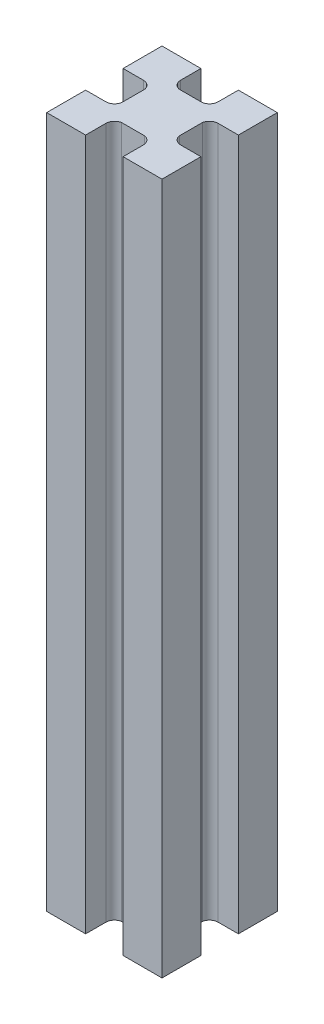
ISO-10303-21;
HEADER;
FILE_DESCRIPTION(('STEP AP214'),'2;1');
FILE_NAME('part.step','',(''),(''),'','','');
FILE_SCHEMA(('AUTOMOTIVE_DESIGN { 1 0 10303 214 1 1 1 1 }'));
ENDSEC;
DATA;
#1=APPLICATION_CONTEXT('core data for automotive mechanical design processes');
#2=APPLICATION_PROTOCOL_DEFINITION('international standard','automotive_design',2000,#1);
#3=PRODUCT_CONTEXT('',#1,'mechanical');
#4=PRODUCT('Part','Part','',(#3));
#5=PRODUCT_RELATED_PRODUCT_CATEGORY('part','',(#4));
#6=PRODUCT_DEFINITION_FORMATION('','',#4);
#7=PRODUCT_DEFINITION_CONTEXT('part definition',#1,'design');
#8=PRODUCT_DEFINITION('design','',#6,#7);
#9=PRODUCT_DEFINITION_SHAPE('','',#8);
#10=(LENGTH_UNIT() NAMED_UNIT(*) SI_UNIT(.MILLI.,.METRE.));
#11=(NAMED_UNIT(*) PLANE_ANGLE_UNIT() SI_UNIT($,.RADIAN.));
#12=(NAMED_UNIT(*) SI_UNIT($,.STERADIAN.) SOLID_ANGLE_UNIT());
#13=UNCERTAINTY_MEASURE_WITH_UNIT(LENGTH_MEASURE(1.E-05),#10,'distance_accuracy_value','');
#14=(GEOMETRIC_REPRESENTATION_CONTEXT(3) GLOBAL_UNCERTAINTY_ASSIGNED_CONTEXT((#13)) GLOBAL_UNIT_ASSIGNED_CONTEXT((#10,
#11,#12)) REPRESENTATION_CONTEXT('',''));
#15=CARTESIAN_POINT('',(0.,0.,0.));
#16=DIRECTION('',(0.,0.,1.));
#17=DIRECTION('',(1.,0.,0.));
#18=AXIS2_PLACEMENT_3D('',#15,#16,#17);
#19=CARTESIAN_POINT('',(670.000000000003,140.,2.16493489801906E-12));
#20=DIRECTION('',(-1.,0.,0.));
#21=DIRECTION('',(0.,0.,1.));
#22=AXIS2_PLACEMENT_3D('',#19,#20,#21);
#23=PLANE('',#22);
#24=DIRECTION('',(0.,0.,-1.));
#25=VECTOR('',#24,1.);
#26=CARTESIAN_POINT('',(670.000000000003,20.,2.16493489801906E-12));
#27=LINE('',#26,#25);
#28=CARTESIAN_POINT('',(670.000000000003,20.,10.0000000000022));
#29=VERTEX_POINT('',#28);
#30=CARTESIAN_POINT('',(669.99999999999,20.,3.24999999999571));
#31=VERTEX_POINT('',#30);
#32=EDGE_CURVE('E11',#29,#31,#27,.T.);
#33=ORIENTED_EDGE('',*,*,#32,.T.);
#34=DIRECTION('',(0.,1.,0.));
#35=VECTOR('',#34,1.);
#36=CARTESIAN_POINT('',(669.99999999999,20.,3.24999999999571));
#37=LINE('',#36,#35);
#38=CARTESIAN_POINT('',(669.99999999999,140.,3.24999999999571));
#39=VERTEX_POINT('',#38);
#40=EDGE_CURVE('E360',#31,#39,#37,.T.);
#41=ORIENTED_EDGE('',*,*,#40,.T.);
#42=DIRECTION('',(0.,0.,-1.));
#43=VECTOR('',#42,1.);
#44=CARTESIAN_POINT('',(670.000000000003,140.,2.16493489801906E-12));
#45=LINE('',#44,#43);
#46=CARTESIAN_POINT('',(670.000000000003,140.,10.0000000000022));
#47=VERTEX_POINT('',#46);
#48=EDGE_CURVE('E49',#47,#39,#45,.T.);
#49=ORIENTED_EDGE('',*,*,#48,.F.);
#50=DIRECTION('',(0.,-1.,0.));
#51=VECTOR('',#50,1.);
#52=CARTESIAN_POINT('',(670.000000000003,140.,10.0000000000022));
#53=LINE('',#52,#51);
#54=EDGE_CURVE('E406',#47,#29,#53,.T.);
#55=ORIENTED_EDGE('',*,*,#54,.T.);
#56=EDGE_LOOP('',(#33,#41,#49,#55));
#57=FACE_BOUND('',#56,.T.);
#58=ADVANCED_FACE('F45',(#57),#23,.F.);
#59=CARTESIAN_POINT('',(650.000000000003,140.,-9.99999999999784));
#60=DIRECTION('',(0.,0.,1.));
#61=DIRECTION('',(1.,0.,0.));
#62=AXIS2_PLACEMENT_3D('',#59,#60,#61);
#63=PLANE('',#62);
#64=DIRECTION('',(-1.,0.,0.));
#65=VECTOR('',#64,1.);
#66=CARTESIAN_POINT('',(650.000000000003,20.,-9.99999999999784));
#67=LINE('',#66,#65);
#68=CARTESIAN_POINT('',(670.000000000003,20.,-9.99999999999784));
#69=VERTEX_POINT('',#68);
#70=CARTESIAN_POINT('',(663.250000000008,20.,-10.000000000004));
#71=VERTEX_POINT('',#70);
#72=EDGE_CURVE('E419',#69,#71,#67,.T.);
#73=ORIENTED_EDGE('',*,*,#72,.T.);
#74=DIRECTION('',(0.,1.,0.));
#75=VECTOR('',#74,1.);
#76=CARTESIAN_POINT('',(663.250000000008,20.,-10.000000000004));
#77=LINE('',#76,#75);
#78=CARTESIAN_POINT('',(663.250000000008,140.,-10.000000000004));
#79=VERTEX_POINT('',#78);
#80=EDGE_CURVE('E278',#71,#79,#77,.T.);
#81=ORIENTED_EDGE('',*,*,#80,.T.);
#82=DIRECTION('',(-1.,0.,0.));
#83=VECTOR('',#82,1.);
#84=CARTESIAN_POINT('',(650.000000000003,140.,-9.99999999999784));
#85=LINE('',#84,#83);
#86=CARTESIAN_POINT('',(670.000000000003,140.,-9.99999999999784));
#87=VERTEX_POINT('',#86);
#88=EDGE_CURVE('E427',#87,#79,#85,.T.);
#89=ORIENTED_EDGE('',*,*,#88,.F.);
#90=DIRECTION('',(0.,-1.,0.));
#91=VECTOR('',#90,1.);
#92=CARTESIAN_POINT('',(670.000000000003,140.,-9.99999999999784));
#93=LINE('',#92,#91);
#94=EDGE_CURVE('E256',#87,#69,#93,.T.);
#95=ORIENTED_EDGE('',*,*,#94,.T.);
#96=EDGE_LOOP('',(#73,#81,#89,#95));
#97=FACE_BOUND('',#96,.T.);
#98=ADVANCED_FACE('F530',(#97),#63,.F.);
#99=CARTESIAN_POINT('',(650.000000000003,140.,10.0000000000022));
#100=DIRECTION('',(1.,0.,0.));
#101=DIRECTION('',(0.,0.,-1.));
#102=AXIS2_PLACEMENT_3D('',#99,#100,#101);
#103=PLANE('',#102);
#104=DIRECTION('',(0.,0.,1.));
#105=VECTOR('',#104,1.);
#106=CARTESIAN_POINT('',(650.000000000003,20.,10.0000000000022));
#107=LINE('',#106,#105);
#108=CARTESIAN_POINT('',(650.000000000003,20.,-9.99999999999784));
#109=VERTEX_POINT('',#108);
#110=CARTESIAN_POINT('',(650.,20.,-3.25000000001271));
#111=VERTEX_POINT('',#110);
#112=EDGE_CURVE('E415',#109,#111,#107,.T.);
#113=ORIENTED_EDGE('',*,*,#112,.T.);
#114=DIRECTION('',(0.,1.,0.));
#115=VECTOR('',#114,1.);
#116=CARTESIAN_POINT('',(650.,20.,-3.25000000001271));
#117=LINE('',#116,#115);
#118=CARTESIAN_POINT('',(650.,140.,-3.25000000001271));
#119=VERTEX_POINT('',#118);
#120=EDGE_CURVE('E270',#111,#119,#117,.T.);
#121=ORIENTED_EDGE('',*,*,#120,.T.);
#122=DIRECTION('',(0.,0.,1.));
#123=VECTOR('',#122,1.);
#124=CARTESIAN_POINT('',(650.000000000003,140.,10.0000000000022));
#125=LINE('',#124,#123);
#126=CARTESIAN_POINT('',(650.000000000003,140.,-9.99999999999784));
#127=VERTEX_POINT('',#126);
#128=EDGE_CURVE('E255',#127,#119,#125,.T.);
#129=ORIENTED_EDGE('',*,*,#128,.F.);
#130=DIRECTION('',(0.,-1.,0.));
#131=VECTOR('',#130,1.);
#132=CARTESIAN_POINT('',(650.000000000003,140.,-9.99999999999784));
#133=LINE('',#132,#131);
#134=EDGE_CURVE('E260',#127,#109,#133,.T.);
#135=ORIENTED_EDGE('',*,*,#134,.T.);
#136=EDGE_LOOP('',(#113,#121,#129,#135));
#137=FACE_BOUND('',#136,.T.);
#138=ADVANCED_FACE('F442',(#137),#103,.F.);
#139=CARTESIAN_POINT('',(670.000000000003,140.,10.0000000000022));
#140=DIRECTION('',(0.,0.,-1.));
#141=DIRECTION('',(-1.,0.,0.));
#142=AXIS2_PLACEMENT_3D('',#139,#140,#141);
#143=PLANE('',#142);
#144=DIRECTION('',(1.,0.,0.));
#145=VECTOR('',#144,1.);
#146=CARTESIAN_POINT('',(670.000000000003,20.,10.0000000000022));
#147=LINE('',#146,#145);
#148=CARTESIAN_POINT('',(650.000000000003,20.,10.0000000000022));
#149=VERTEX_POINT('',#148);
#150=CARTESIAN_POINT('',(656.749999999999,20.,9.99999999999557));
#151=VERTEX_POINT('',#150);
#152=EDGE_CURVE('E410',#149,#151,#147,.T.);
#153=ORIENTED_EDGE('',*,*,#152,.T.);
#154=DIRECTION('',(0.,1.,0.));
#155=VECTOR('',#154,1.);
#156=CARTESIAN_POINT('',(656.749999999999,20.,9.99999999999557));
#157=LINE('',#156,#155);
#158=CARTESIAN_POINT('',(656.749999999999,140.,9.99999999999557));
#159=VERTEX_POINT('',#158);
#160=EDGE_CURVE('E318',#151,#159,#157,.T.);
#161=ORIENTED_EDGE('',*,*,#160,.T.);
#162=DIRECTION('',(1.,0.,0.));
#163=VECTOR('',#162,1.);
#164=CARTESIAN_POINT('',(670.000000000003,140.,10.0000000000022));
#165=LINE('',#164,#163);
#166=CARTESIAN_POINT('',(650.000000000003,140.,10.0000000000022));
#167=VERTEX_POINT('',#166);
#168=EDGE_CURVE('E422',#167,#159,#165,.T.);
#169=ORIENTED_EDGE('',*,*,#168,.F.);
#170=DIRECTION('',(0.,-1.,0.));
#171=VECTOR('',#170,1.);
#172=CARTESIAN_POINT('',(650.000000000003,140.,10.0000000000022));
#173=LINE('',#172,#171);
#174=EDGE_CURVE('E403',#167,#149,#173,.T.);
#175=ORIENTED_EDGE('',*,*,#174,.T.);
#176=EDGE_LOOP('',(#153,#161,#169,#175));
#177=FACE_BOUND('',#176,.T.);
#178=ADVANCED_FACE('F474',(#177),#143,.F.);
#179=CARTESIAN_POINT('',(669.99999999999,140.,-3.25000000001318));
#180=VERTEX_POINT('',#179);
#181=EDGE_CURVE('E429',#180,#87,#45,.T.);
#182=ORIENTED_EDGE('',*,*,#181,.F.);
#183=DIRECTION('',(0.,1.,0.));
#184=VECTOR('',#183,1.);
#185=CARTESIAN_POINT('',(669.99999999999,20.,-3.25000000001318));
#186=LINE('',#185,#184);
#187=CARTESIAN_POINT('',(669.99999999999,20.,-3.25000000001318));
#188=VERTEX_POINT('',#187);
#189=EDGE_CURVE('E364',#188,#180,#186,.T.);
#190=ORIENTED_EDGE('',*,*,#189,.F.);
#191=EDGE_CURVE('E54',#188,#69,#27,.T.);
#192=ORIENTED_EDGE('',*,*,#191,.T.);
#193=ORIENTED_EDGE('',*,*,#94,.F.);
#194=EDGE_LOOP('',(#182,#190,#192,#193));
#195=FACE_BOUND('',#194,.T.);
#196=ADVANCED_FACE('F525',(#195),#23,.F.);
#197=CARTESIAN_POINT('',(656.75,140.,-10.000000000004));
#198=VERTEX_POINT('',#197);
#199=EDGE_CURVE('E426',#198,#127,#85,.T.);
#200=ORIENTED_EDGE('',*,*,#199,.F.);
#201=DIRECTION('',(0.,1.,0.));
#202=VECTOR('',#201,1.);
#203=CARTESIAN_POINT('',(656.75,20.,-10.000000000004));
#204=LINE('',#203,#202);
#205=CARTESIAN_POINT('',(656.75,20.,-10.000000000004));
#206=VERTEX_POINT('',#205);
#207=EDGE_CURVE('E282',#206,#198,#204,.T.);
#208=ORIENTED_EDGE('',*,*,#207,.F.);
#209=EDGE_CURVE('E418',#206,#109,#67,.T.);
#210=ORIENTED_EDGE('',*,*,#209,.T.);
#211=ORIENTED_EDGE('',*,*,#134,.F.);
#212=EDGE_LOOP('',(#200,#208,#210,#211));
#213=FACE_BOUND('',#212,.T.);
#214=ADVANCED_FACE('F438',(#213),#63,.F.);
#215=CARTESIAN_POINT('',(650.,140.,3.24999999999579));
#216=VERTEX_POINT('',#215);
#217=EDGE_CURVE('E425',#216,#167,#125,.T.);
#218=ORIENTED_EDGE('',*,*,#217,.F.);
#219=DIRECTION('',(0.,1.,0.));
#220=VECTOR('',#219,1.);
#221=CARTESIAN_POINT('',(650.,20.,3.24999999999579));
#222=LINE('',#221,#220);
#223=CARTESIAN_POINT('',(650.,20.,3.24999999999579));
#224=VERTEX_POINT('',#223);
#225=EDGE_CURVE('E443',#224,#216,#222,.T.);
#226=ORIENTED_EDGE('',*,*,#225,.F.);
#227=EDGE_CURVE('E413',#224,#149,#107,.T.);
#228=ORIENTED_EDGE('',*,*,#227,.T.);
#229=ORIENTED_EDGE('',*,*,#174,.F.);
#230=EDGE_LOOP('',(#218,#226,#228,#229));
#231=FACE_BOUND('',#230,.T.);
#232=ADVANCED_FACE('F468',(#231),#103,.F.);
#233=CARTESIAN_POINT('',(663.250000000009,140.,9.99999999999557));
#234=VERTEX_POINT('',#233);
#235=EDGE_CURVE('E409',#234,#47,#165,.T.);
#236=ORIENTED_EDGE('',*,*,#235,.F.);
#237=DIRECTION('',(0.,1.,0.));
#238=VECTOR('',#237,1.);
#239=CARTESIAN_POINT('',(663.250000000009,20.,9.99999999999557));
#240=LINE('',#239,#238);
#241=CARTESIAN_POINT('',(663.250000000009,20.,9.99999999999557));
#242=VERTEX_POINT('',#241);
#243=EDGE_CURVE('E322',#242,#234,#240,.T.);
#244=ORIENTED_EDGE('',*,*,#243,.F.);
#245=EDGE_CURVE('E414',#242,#29,#147,.T.);
#246=ORIENTED_EDGE('',*,*,#245,.T.);
#247=ORIENTED_EDGE('',*,*,#54,.F.);
#248=EDGE_LOOP('',(#236,#244,#246,#247));
#249=FACE_BOUND('',#248,.T.);
#250=ADVANCED_FACE('F497',(#249),#143,.F.);
#251=CARTESIAN_POINT('',(0.,140.,0.));
#252=DIRECTION('',(0.,-1.,0.));
#253=DIRECTION('',(0.,0.,-1.));
#254=AXIS2_PLACEMENT_3D('',#251,#252,#253);
#255=PLANE('',#254);
#256=ORIENTED_EDGE('',*,*,#128,.T.);
#257=DIRECTION('',(-1.,0.,0.));
#258=VECTOR('',#257,1.);
#259=CARTESIAN_POINT('',(650.,140.,-3.25000000001271));
#260=LINE('',#259,#258);
#261=CARTESIAN_POINT('',(653.500000000009,140.,-3.25000000001267));
#262=VERTEX_POINT('',#261);
#263=EDGE_CURVE('E235',#262,#119,#260,.T.);
#264=ORIENTED_EDGE('',*,*,#263,.F.);
#265=CARTESIAN_POINT('',(653.500000000009,140.,-1.72500000001268));
#266=DIRECTION('',(0.,1.,0.));
#267=DIRECTION('',(0.,0.,-1.));
#268=AXIS2_PLACEMENT_3D('',#265,#266,#267);
#269=CIRCLE('',#268,1.52499999999999);
#270=CARTESIAN_POINT('',(655.000000000009,140.,-2.00000000001273));
#271=VERTEX_POINT('',#270);
#272=EDGE_CURVE('E246',#271,#262,#269,.T.);
#273=ORIENTED_EDGE('',*,*,#272,.F.);
#274=DIRECTION('',(0.,0.,-1.));
#275=VECTOR('',#274,1.);
#276=CARTESIAN_POINT('',(655.000000000009,140.,1.99999999998727));
#277=LINE('',#276,#275);
#278=CARTESIAN_POINT('',(655.000000000009,140.,1.99999999998728));
#279=VERTEX_POINT('',#278);
#280=EDGE_CURVE('E251',#279,#271,#277,.T.);
#281=ORIENTED_EDGE('',*,*,#280,.F.);
#282=CARTESIAN_POINT('',(653.500000000007,140.,1.72499999999583));
#283=DIRECTION('',(0.,1.,0.));
#284=DIRECTION('',(0.,0.,1.));
#285=AXIS2_PLACEMENT_3D('',#282,#283,#284);
#286=CIRCLE('',#285,1.52499999999994);
#287=CARTESIAN_POINT('',(653.5,140.,3.24999999999579));
#288=VERTEX_POINT('',#287);
#289=EDGE_CURVE('E263',#288,#279,#286,.T.);
#290=ORIENTED_EDGE('',*,*,#289,.F.);
#291=DIRECTION('',(1.,0.,0.));
#292=VECTOR('',#291,1.);
#293=CARTESIAN_POINT('',(650.,140.,3.24999999999579));
#294=LINE('',#293,#292);
#295=EDGE_CURVE('E257',#216,#288,#294,.T.);
#296=ORIENTED_EDGE('',*,*,#295,.F.);
#297=ORIENTED_EDGE('',*,*,#217,.T.);
#298=ORIENTED_EDGE('',*,*,#168,.T.);
#299=DIRECTION('',(0.,0.,1.));
#300=VECTOR('',#299,1.);
#301=CARTESIAN_POINT('',(656.749999999999,140.,9.99999999999557));
#302=LINE('',#301,#300);
#303=CARTESIAN_POINT('',(656.749999999999,140.,6.49999999999551));
#304=VERTEX_POINT('',#303);
#305=EDGE_CURVE('E292',#304,#159,#302,.T.);
#306=ORIENTED_EDGE('',*,*,#305,.F.);
#307=CARTESIAN_POINT('',(658.274999999999,140.,6.49999999999551));
#308=DIRECTION('',(0.,1.,0.));
#309=DIRECTION('',(0.,0.,-1.));
#310=AXIS2_PLACEMENT_3D('',#307,#308,#309);
#311=CIRCLE('',#310,1.52499999999992);
#312=CARTESIAN_POINT('',(658.,140.,4.99999999999542));
#313=VERTEX_POINT('',#312);
#314=EDGE_CURVE('E333',#313,#304,#311,.T.);
#315=ORIENTED_EDGE('',*,*,#314,.F.);
#316=DIRECTION('',(-1.,0.,0.));
#317=VECTOR('',#316,1.);
#318=CARTESIAN_POINT('',(662.,140.,4.99999999999542));
#319=LINE('',#318,#317);
#320=CARTESIAN_POINT('',(662.,140.,4.99999999999541));
#321=VERTEX_POINT('',#320);
#322=EDGE_CURVE('E336',#321,#313,#319,.T.);
#323=ORIENTED_EDGE('',*,*,#322,.F.);
#324=CARTESIAN_POINT('',(661.725000000009,140.,6.49999999999672));
#325=DIRECTION('',(0.,1.,0.));
#326=DIRECTION('',(0.,0.,1.));
#327=AXIS2_PLACEMENT_3D('',#324,#325,#326);
#328=CIRCLE('',#327,1.52499999999966);
#329=CARTESIAN_POINT('',(663.250000000009,140.,6.50000000000418));
#330=VERTEX_POINT('',#329);
#331=EDGE_CURVE('E340',#330,#321,#328,.T.);
#332=ORIENTED_EDGE('',*,*,#331,.F.);
#333=DIRECTION('',(0.,0.,-1.));
#334=VECTOR('',#333,1.);
#335=CARTESIAN_POINT('',(663.250000000009,140.,9.99999999999557));
#336=LINE('',#335,#334);
#337=EDGE_CURVE('E343',#234,#330,#336,.T.);
#338=ORIENTED_EDGE('',*,*,#337,.F.);
#339=ORIENTED_EDGE('',*,*,#235,.T.);
#340=ORIENTED_EDGE('',*,*,#48,.T.);
#341=DIRECTION('',(1.,0.,0.));
#342=VECTOR('',#341,1.);
#343=CARTESIAN_POINT('',(669.99999999999,140.,3.24999999999571));
#344=LINE('',#343,#342);
#345=CARTESIAN_POINT('',(666.49999999999,140.,3.24999999999572));
#346=VERTEX_POINT('',#345);
#347=EDGE_CURVE('E332',#346,#39,#344,.T.);
#348=ORIENTED_EDGE('',*,*,#347,.F.);
#349=CARTESIAN_POINT('',(666.49999999999,140.,1.72499999999568));
#350=DIRECTION('',(0.,1.,0.));
#351=DIRECTION('',(0.,0.,-1.));
#352=AXIS2_PLACEMENT_3D('',#349,#350,#351);
#353=CIRCLE('',#352,1.52500000000004);
#354=CARTESIAN_POINT('',(664.99999999999,140.,1.9999999999957));
#355=VERTEX_POINT('',#354);
#356=EDGE_CURVE('E374',#355,#346,#353,.T.);
#357=ORIENTED_EDGE('',*,*,#356,.F.);
#358=DIRECTION('',(0.,0.,1.));
#359=VECTOR('',#358,1.);
#360=CARTESIAN_POINT('',(664.99999999999,140.,-2.00000000000431));
#361=LINE('',#360,#359);
#362=CARTESIAN_POINT('',(664.99999999999,140.,-2.0000000000043));
#363=VERTEX_POINT('',#362);
#364=EDGE_CURVE('E377',#363,#355,#361,.T.);
#365=ORIENTED_EDGE('',*,*,#364,.F.);
#366=CARTESIAN_POINT('',(666.499999999992,140.,-1.72500000001307));
#367=DIRECTION('',(0.,1.,0.));
#368=DIRECTION('',(0.,0.,1.));
#369=AXIS2_PLACEMENT_3D('',#366,#367,#368);
#370=CIRCLE('',#369,1.52500000000011);
#371=CARTESIAN_POINT('',(666.5,140.,-3.25000000001318));
#372=VERTEX_POINT('',#371);
#373=EDGE_CURVE('E381',#372,#363,#370,.T.);
#374=ORIENTED_EDGE('',*,*,#373,.F.);
#375=DIRECTION('',(-1.,0.,0.));
#376=VECTOR('',#375,1.);
#377=CARTESIAN_POINT('',(669.99999999999,140.,-3.25000000001318));
#378=LINE('',#377,#376);
#379=EDGE_CURVE('E384',#180,#372,#378,.T.);
#380=ORIENTED_EDGE('',*,*,#379,.F.);
#381=ORIENTED_EDGE('',*,*,#181,.T.);
#382=ORIENTED_EDGE('',*,*,#88,.T.);
#383=DIRECTION('',(0.,0.,-1.));
#384=VECTOR('',#383,1.);
#385=CARTESIAN_POINT('',(663.250000000008,140.,-10.000000000004));
#386=LINE('',#385,#384);
#387=CARTESIAN_POINT('',(663.250000000008,140.,-6.49999999999522));
#388=VERTEX_POINT('',#387);
#389=EDGE_CURVE('E243',#388,#79,#386,.T.);
#390=ORIENTED_EDGE('',*,*,#389,.F.);
#391=CARTESIAN_POINT('',(661.725000000008,140.,-6.49999999999519));
#392=DIRECTION('',(0.,1.,0.));
#393=DIRECTION('',(0.,0.,-1.));
#394=AXIS2_PLACEMENT_3D('',#391,#392,#393);
#395=CIRCLE('',#394,1.52500000000003);
#396=CARTESIAN_POINT('',(662.000000000008,140.,-4.99999999999518));
#397=VERTEX_POINT('',#396);
#398=EDGE_CURVE('E293',#397,#388,#395,.T.);
#399=ORIENTED_EDGE('',*,*,#398,.F.);
#400=DIRECTION('',(1.,0.,0.));
#401=VECTOR('',#400,1.);
#402=CARTESIAN_POINT('',(658.000000000008,140.,-4.99999999999518));
#403=LINE('',#402,#401);
#404=CARTESIAN_POINT('',(658.000000000008,140.,-4.99999999999521));
#405=VERTEX_POINT('',#404);
#406=EDGE_CURVE('E296',#405,#397,#403,.T.);
#407=ORIENTED_EDGE('',*,*,#406,.F.);
#408=CARTESIAN_POINT('',(658.274999999999,140.,-6.49999999999673));
#409=DIRECTION('',(0.,1.,0.));
#410=DIRECTION('',(0.,0.,1.));
#411=AXIS2_PLACEMENT_3D('',#408,#409,#410);
#412=CIRCLE('',#411,1.52499999999992);
#413=CARTESIAN_POINT('',(656.75,140.,-6.50000000000417));
#414=VERTEX_POINT('',#413);
#415=EDGE_CURVE('E300',#414,#405,#412,.T.);
#416=ORIENTED_EDGE('',*,*,#415,.F.);
#417=DIRECTION('',(0.,0.,1.));
#418=VECTOR('',#417,1.);
#419=CARTESIAN_POINT('',(656.75,140.,-10.000000000004));
#420=LINE('',#419,#418);
#421=EDGE_CURVE('E303',#198,#414,#420,.T.);
#422=ORIENTED_EDGE('',*,*,#421,.F.);
#423=ORIENTED_EDGE('',*,*,#199,.T.);
#424=EDGE_LOOP('',(#256,#264,#273,#281,#290,#296,#297,#298,#306,#315,#323,#332,#338,#339,#340,
#348,#357,#365,#374,#380,#381,#382,#390,#399,#407,#416,#422,#423));
#425=FACE_BOUND('',#424,.T.);
#426=ADVANCED_FACE('F47',(#425),#255,.F.);
#427=CARTESIAN_POINT('',(0.,20.,0.));
#428=DIRECTION('',(0.,-1.,0.));
#429=DIRECTION('',(0.,0.,-1.));
#430=AXIS2_PLACEMENT_3D('',#427,#428,#429);
#431=PLANE('',#430);
#432=DIRECTION('',(-1.,0.,0.));
#433=VECTOR('',#432,1.);
#434=CARTESIAN_POINT('',(650.,20.,-3.25000000001271));
#435=LINE('',#434,#433);
#436=CARTESIAN_POINT('',(653.500000000009,20.,-3.25000000001267));
#437=VERTEX_POINT('',#436);
#438=EDGE_CURVE('E238',#437,#111,#435,.T.);
#439=ORIENTED_EDGE('',*,*,#438,.T.);
#440=ORIENTED_EDGE('',*,*,#112,.F.);
#441=ORIENTED_EDGE('',*,*,#209,.F.);
#442=DIRECTION('',(0.,0.,1.));
#443=VECTOR('',#442,1.);
#444=CARTESIAN_POINT('',(656.75,20.,-10.000000000004));
#445=LINE('',#444,#443);
#446=CARTESIAN_POINT('',(656.75,20.,-6.50000000000417));
#447=VERTEX_POINT('',#446);
#448=EDGE_CURVE('E313',#206,#447,#445,.T.);
#449=ORIENTED_EDGE('',*,*,#448,.T.);
#450=CARTESIAN_POINT('',(658.274999999999,20.,-6.49999999999673));
#451=DIRECTION('',(0.,1.,0.));
#452=DIRECTION('',(0.,0.,1.));
#453=AXIS2_PLACEMENT_3D('',#450,#451,#452);
#454=CIRCLE('',#453,1.52499999999992);
#455=CARTESIAN_POINT('',(658.000000000008,20.,-4.99999999999521));
#456=VERTEX_POINT('',#455);
#457=EDGE_CURVE('E70',#447,#456,#454,.T.);
#458=ORIENTED_EDGE('',*,*,#457,.T.);
#459=DIRECTION('',(1.,0.,0.));
#460=VECTOR('',#459,1.);
#461=CARTESIAN_POINT('',(658.000000000008,20.,-4.99999999999518));
#462=LINE('',#461,#460);
#463=CARTESIAN_POINT('',(662.000000000008,20.,-4.99999999999518));
#464=VERTEX_POINT('',#463);
#465=EDGE_CURVE('E309',#456,#464,#462,.T.);
#466=ORIENTED_EDGE('',*,*,#465,.T.);
#467=CARTESIAN_POINT('',(661.725000000008,20.,-6.49999999999519));
#468=DIRECTION('',(0.,1.,0.));
#469=DIRECTION('',(0.,0.,-1.));
#470=AXIS2_PLACEMENT_3D('',#467,#468,#469);
#471=CIRCLE('',#470,1.52500000000003);
#472=CARTESIAN_POINT('',(663.250000000008,20.,-6.49999999999522));
#473=VERTEX_POINT('',#472);
#474=EDGE_CURVE('E281',#464,#473,#471,.T.);
#475=ORIENTED_EDGE('',*,*,#474,.T.);
#476=DIRECTION('',(0.,0.,-1.));
#477=VECTOR('',#476,1.);
#478=CARTESIAN_POINT('',(663.250000000008,20.,-10.000000000004));
#479=LINE('',#478,#477);
#480=EDGE_CURVE('E297',#473,#71,#479,.T.);
#481=ORIENTED_EDGE('',*,*,#480,.T.);
#482=ORIENTED_EDGE('',*,*,#72,.F.);
#483=ORIENTED_EDGE('',*,*,#191,.F.);
#484=DIRECTION('',(-1.,0.,0.));
#485=VECTOR('',#484,1.);
#486=CARTESIAN_POINT('',(669.99999999999,20.,-3.25000000001318));
#487=LINE('',#486,#485);
#488=CARTESIAN_POINT('',(666.5,20.,-3.25000000001318));
#489=VERTEX_POINT('',#488);
#490=EDGE_CURVE('E396',#188,#489,#487,.T.);
#491=ORIENTED_EDGE('',*,*,#490,.T.);
#492=CARTESIAN_POINT('',(666.499999999992,20.,-1.72500000001307));
#493=DIRECTION('',(0.,1.,0.));
#494=DIRECTION('',(0.,0.,1.));
#495=AXIS2_PLACEMENT_3D('',#492,#493,#494);
#496=CIRCLE('',#495,1.52500000000011);
#497=CARTESIAN_POINT('',(664.99999999999,20.,-2.0000000000043));
#498=VERTEX_POINT('',#497);
#499=EDGE_CURVE('E393',#489,#498,#496,.T.);
#500=ORIENTED_EDGE('',*,*,#499,.T.);
#501=DIRECTION('',(0.,0.,1.));
#502=VECTOR('',#501,1.);
#503=CARTESIAN_POINT('',(664.99999999999,20.,-2.00000000000431));
#504=LINE('',#503,#502);
#505=CARTESIAN_POINT('',(664.99999999999,20.,1.9999999999957));
#506=VERTEX_POINT('',#505);
#507=EDGE_CURVE('E390',#498,#506,#504,.T.);
#508=ORIENTED_EDGE('',*,*,#507,.T.);
#509=CARTESIAN_POINT('',(666.49999999999,20.,1.72499999999568));
#510=DIRECTION('',(0.,1.,0.));
#511=DIRECTION('',(0.,0.,-1.));
#512=AXIS2_PLACEMENT_3D('',#509,#510,#511);
#513=CIRCLE('',#512,1.52500000000004);
#514=CARTESIAN_POINT('',(666.49999999999,20.,3.24999999999572));
#515=VERTEX_POINT('',#514);
#516=EDGE_CURVE('E363',#506,#515,#513,.T.);
#517=ORIENTED_EDGE('',*,*,#516,.T.);
#518=DIRECTION('',(1.,0.,0.));
#519=VECTOR('',#518,1.);
#520=CARTESIAN_POINT('',(669.99999999999,20.,3.24999999999571));
#521=LINE('',#520,#519);
#522=EDGE_CURVE('E378',#515,#31,#521,.T.);
#523=ORIENTED_EDGE('',*,*,#522,.T.);
#524=ORIENTED_EDGE('',*,*,#32,.F.);
#525=ORIENTED_EDGE('',*,*,#245,.F.);
#526=DIRECTION('',(0.,0.,-1.));
#527=VECTOR('',#526,1.);
#528=CARTESIAN_POINT('',(663.250000000009,20.,9.99999999999557));
#529=LINE('',#528,#527);
#530=CARTESIAN_POINT('',(663.250000000009,20.,6.50000000000418));
#531=VERTEX_POINT('',#530);
#532=EDGE_CURVE('E355',#242,#531,#529,.T.);
#533=ORIENTED_EDGE('',*,*,#532,.T.);
#534=CARTESIAN_POINT('',(661.725000000009,20.,6.49999999999672));
#535=DIRECTION('',(0.,1.,0.));
#536=DIRECTION('',(0.,0.,1.));
#537=AXIS2_PLACEMENT_3D('',#534,#535,#536);
#538=CIRCLE('',#537,1.52499999999966);
#539=CARTESIAN_POINT('',(662.,20.,4.99999999999541));
#540=VERTEX_POINT('',#539);
#541=EDGE_CURVE('E352',#531,#540,#538,.T.);
#542=ORIENTED_EDGE('',*,*,#541,.T.);
#543=DIRECTION('',(-1.,0.,0.));
#544=VECTOR('',#543,1.);
#545=CARTESIAN_POINT('',(662.,20.,4.99999999999542));
#546=LINE('',#545,#544);
#547=CARTESIAN_POINT('',(658.,20.,4.99999999999542));
#548=VERTEX_POINT('',#547);
#549=EDGE_CURVE('E349',#540,#548,#546,.T.);
#550=ORIENTED_EDGE('',*,*,#549,.T.);
#551=CARTESIAN_POINT('',(658.274999999999,20.,6.49999999999551));
#552=DIRECTION('',(0.,1.,0.));
#553=DIRECTION('',(0.,0.,-1.));
#554=AXIS2_PLACEMENT_3D('',#551,#552,#553);
#555=CIRCLE('',#554,1.52499999999992);
#556=CARTESIAN_POINT('',(656.749999999999,20.,6.49999999999551));
#557=VERTEX_POINT('',#556);
#558=EDGE_CURVE('E321',#548,#557,#555,.T.);
#559=ORIENTED_EDGE('',*,*,#558,.T.);
#560=DIRECTION('',(0.,0.,1.));
#561=VECTOR('',#560,1.);
#562=CARTESIAN_POINT('',(656.749999999999,20.,9.99999999999557));
#563=LINE('',#562,#561);
#564=EDGE_CURVE('E337',#557,#151,#563,.T.);
#565=ORIENTED_EDGE('',*,*,#564,.T.);
#566=ORIENTED_EDGE('',*,*,#152,.F.);
#567=ORIENTED_EDGE('',*,*,#227,.F.);
#568=DIRECTION('',(1.,0.,0.));
#569=VECTOR('',#568,1.);
#570=CARTESIAN_POINT('',(650.,20.,3.24999999999579));
#571=LINE('',#570,#569);
#572=CARTESIAN_POINT('',(653.5,20.,3.24999999999579));
#573=VERTEX_POINT('',#572);
#574=EDGE_CURVE('E274',#224,#573,#571,.T.);
#575=ORIENTED_EDGE('',*,*,#574,.T.);
#576=CARTESIAN_POINT('',(653.500000000007,20.,1.72499999999583));
#577=DIRECTION('',(0.,1.,0.));
#578=DIRECTION('',(0.,0.,1.));
#579=AXIS2_PLACEMENT_3D('',#576,#577,#578);
#580=CIRCLE('',#579,1.52499999999994);
#581=CARTESIAN_POINT('',(655.000000000009,20.,1.99999999998728));
#582=VERTEX_POINT('',#581);
#583=EDGE_CURVE('E62',#573,#582,#580,.T.);
#584=ORIENTED_EDGE('',*,*,#583,.T.);
#585=DIRECTION('',(0.,0.,-1.));
#586=VECTOR('',#585,1.);
#587=CARTESIAN_POINT('',(655.000000000009,20.,1.99999999998727));
#588=LINE('',#587,#586);
#589=CARTESIAN_POINT('',(655.000000000009,20.,-2.00000000001273));
#590=VERTEX_POINT('',#589);
#591=EDGE_CURVE('E269',#582,#590,#588,.T.);
#592=ORIENTED_EDGE('',*,*,#591,.T.);
#593=CARTESIAN_POINT('',(653.500000000009,20.,-1.72500000001268));
#594=DIRECTION('',(0.,1.,0.));
#595=DIRECTION('',(0.,0.,-1.));
#596=AXIS2_PLACEMENT_3D('',#593,#594,#595);
#597=CIRCLE('',#596,1.52499999999999);
#598=EDGE_CURVE('E267',#590,#437,#597,.T.);
#599=ORIENTED_EDGE('',*,*,#598,.T.);
#600=EDGE_LOOP('',(#439,#440,#441,#449,#458,#466,#475,#481,#482,#483,#491,#500,#508,#517,#523,
#524,#525,#533,#542,#550,#559,#565,#566,#567,#575,#584,#592,#599));
#601=FACE_BOUND('',#600,.T.);
#602=ADVANCED_FACE('F460',(#601),#431,.T.);
#603=CARTESIAN_POINT('',(669.99999999999,20.,3.24999999999571));
#604=DIRECTION('',(0.,0.,1.));
#605=DIRECTION('',(1.,0.,0.));
#606=AXIS2_PLACEMENT_3D('',#603,#604,#605);
#607=PLANE('',#606);
#608=ORIENTED_EDGE('',*,*,#347,.T.);
#609=ORIENTED_EDGE('',*,*,#40,.F.);
#610=ORIENTED_EDGE('',*,*,#522,.F.);
#611=DIRECTION('',(0.,1.,0.));
#612=VECTOR('',#611,1.);
#613=CARTESIAN_POINT('',(666.49999999999,20.,3.24999999999572));
#614=LINE('',#613,#612);
#615=EDGE_CURVE('E372',#515,#346,#614,.T.);
#616=ORIENTED_EDGE('',*,*,#615,.T.);
#617=EDGE_LOOP('',(#608,#609,#610,#616));
#618=FACE_BOUND('',#617,.T.);
#619=ADVANCED_FACE('F506',(#618),#607,.F.);
#620=CARTESIAN_POINT('',(666.49999999999,20.,1.72499999999568));
#621=DIRECTION('',(0.,1.,0.));
#622=DIRECTION('',(0.,0.,1.));
#623=AXIS2_PLACEMENT_3D('',#620,#621,#622);
#624=CYLINDRICAL_SURFACE('',#623,1.52500000000004);
#625=ORIENTED_EDGE('',*,*,#356,.T.);
#626=ORIENTED_EDGE('',*,*,#615,.F.);
#627=ORIENTED_EDGE('',*,*,#516,.F.);
#628=DIRECTION('',(0.,1.,0.));
#629=VECTOR('',#628,1.);
#630=CARTESIAN_POINT('',(664.99999999999,20.,1.9999999999957));
#631=LINE('',#630,#629);
#632=EDGE_CURVE('E370',#506,#355,#631,.T.);
#633=ORIENTED_EDGE('',*,*,#632,.T.);
#634=EDGE_LOOP('',(#625,#626,#627,#633));
#635=FACE_BOUND('',#634,.T.);
#636=ADVANCED_FACE('F510',(#635),#624,.F.);
#637=CARTESIAN_POINT('',(664.99999999999,20.,-2.00000000000431));
#638=DIRECTION('',(-1.,0.,0.));
#639=DIRECTION('',(0.,0.,1.));
#640=AXIS2_PLACEMENT_3D('',#637,#638,#639);
#641=PLANE('',#640);
#642=ORIENTED_EDGE('',*,*,#364,.T.);
#643=ORIENTED_EDGE('',*,*,#632,.F.);
#644=ORIENTED_EDGE('',*,*,#507,.F.);
#645=DIRECTION('',(0.,1.,0.));
#646=VECTOR('',#645,1.);
#647=CARTESIAN_POINT('',(664.99999999999,20.,-2.0000000000043));
#648=LINE('',#647,#646);
#649=EDGE_CURVE('E368',#498,#363,#648,.T.);
#650=ORIENTED_EDGE('',*,*,#649,.T.);
#651=EDGE_LOOP('',(#642,#643,#644,#650));
#652=FACE_BOUND('',#651,.T.);
#653=ADVANCED_FACE('F513',(#652),#641,.F.);
#654=CARTESIAN_POINT('',(666.499999999992,20.,-1.72500000001307));
#655=DIRECTION('',(0.,1.,0.));
#656=DIRECTION('',(0.,0.,1.));
#657=AXIS2_PLACEMENT_3D('',#654,#655,#656);
#658=CYLINDRICAL_SURFACE('',#657,1.52500000000011);
#659=ORIENTED_EDGE('',*,*,#373,.T.);
#660=ORIENTED_EDGE('',*,*,#649,.F.);
#661=ORIENTED_EDGE('',*,*,#499,.F.);
#662=DIRECTION('',(0.,1.,0.));
#663=VECTOR('',#662,1.);
#664=CARTESIAN_POINT('',(666.5,20.,-3.25000000001318));
#665=LINE('',#664,#663);
#666=EDGE_CURVE('E366',#489,#372,#665,.T.);
#667=ORIENTED_EDGE('',*,*,#666,.T.);
#668=EDGE_LOOP('',(#659,#660,#661,#667));
#669=FACE_BOUND('',#668,.T.);
#670=ADVANCED_FACE('F518',(#669),#658,.F.);
#671=CARTESIAN_POINT('',(669.99999999999,20.,-3.25000000001318));
#672=DIRECTION('',(0.,0.,-1.));
#673=DIRECTION('',(-1.,0.,0.));
#674=AXIS2_PLACEMENT_3D('',#671,#672,#673);
#675=PLANE('',#674);
#676=ORIENTED_EDGE('',*,*,#379,.T.);
#677=ORIENTED_EDGE('',*,*,#666,.F.);
#678=ORIENTED_EDGE('',*,*,#490,.F.);
#679=ORIENTED_EDGE('',*,*,#189,.T.);
#680=EDGE_LOOP('',(#676,#677,#678,#679));
#681=FACE_BOUND('',#680,.T.);
#682=ADVANCED_FACE('F521',(#681),#675,.F.);
#683=CARTESIAN_POINT('',(656.749999999999,20.,9.99999999999557));
#684=DIRECTION('',(-1.,0.,0.));
#685=DIRECTION('',(0.,0.,1.));
#686=AXIS2_PLACEMENT_3D('',#683,#684,#685);
#687=PLANE('',#686);
#688=ORIENTED_EDGE('',*,*,#305,.T.);
#689=ORIENTED_EDGE('',*,*,#160,.F.);
#690=ORIENTED_EDGE('',*,*,#564,.F.);
#691=DIRECTION('',(0.,1.,0.));
#692=VECTOR('',#691,1.);
#693=CARTESIAN_POINT('',(656.749999999999,20.,6.49999999999551));
#694=LINE('',#693,#692);
#695=EDGE_CURVE('E330',#557,#304,#694,.T.);
#696=ORIENTED_EDGE('',*,*,#695,.T.);
#697=EDGE_LOOP('',(#688,#689,#690,#696));
#698=FACE_BOUND('',#697,.T.);
#699=ADVANCED_FACE('F477',(#698),#687,.F.);
#700=CARTESIAN_POINT('',(658.274999999999,20.,6.49999999999551));
#701=DIRECTION('',(0.,1.,0.));
#702=DIRECTION('',(0.,0.,1.));
#703=AXIS2_PLACEMENT_3D('',#700,#701,#702);
#704=CYLINDRICAL_SURFACE('',#703,1.52499999999992);
#705=ORIENTED_EDGE('',*,*,#314,.T.);
#706=ORIENTED_EDGE('',*,*,#695,.F.);
#707=ORIENTED_EDGE('',*,*,#558,.F.);
#708=DIRECTION('',(0.,1.,0.));
#709=VECTOR('',#708,1.);
#710=CARTESIAN_POINT('',(658.,20.,4.99999999999542));
#711=LINE('',#710,#709);
#712=EDGE_CURVE('E328',#548,#313,#711,.T.);
#713=ORIENTED_EDGE('',*,*,#712,.T.);
#714=EDGE_LOOP('',(#705,#706,#707,#713));
#715=FACE_BOUND('',#714,.T.);
#716=ADVANCED_FACE('F481',(#715),#704,.F.);
#717=CARTESIAN_POINT('',(662.,20.,4.99999999999542));
#718=DIRECTION('',(0.,0.,-1.));
#719=DIRECTION('',(-1.,0.,0.));
#720=AXIS2_PLACEMENT_3D('',#717,#718,#719);
#721=PLANE('',#720);
#722=ORIENTED_EDGE('',*,*,#322,.T.);
#723=ORIENTED_EDGE('',*,*,#712,.F.);
#724=ORIENTED_EDGE('',*,*,#549,.F.);
#725=DIRECTION('',(0.,1.,0.));
#726=VECTOR('',#725,1.);
#727=CARTESIAN_POINT('',(662.,20.,4.99999999999541));
#728=LINE('',#727,#726);
#729=EDGE_CURVE('E326',#540,#321,#728,.T.);
#730=ORIENTED_EDGE('',*,*,#729,.T.);
#731=EDGE_LOOP('',(#722,#723,#724,#730));
#732=FACE_BOUND('',#731,.T.);
#733=ADVANCED_FACE('F486',(#732),#721,.F.);
#734=CARTESIAN_POINT('',(661.725000000009,20.,6.49999999999672));
#735=DIRECTION('',(0.,1.,0.));
#736=DIRECTION('',(0.,0.,1.));
#737=AXIS2_PLACEMENT_3D('',#734,#735,#736);
#738=CYLINDRICAL_SURFACE('',#737,1.52499999999966);
#739=ORIENTED_EDGE('',*,*,#331,.T.);
#740=ORIENTED_EDGE('',*,*,#729,.F.);
#741=ORIENTED_EDGE('',*,*,#541,.F.);
#742=DIRECTION('',(0.,1.,0.));
#743=VECTOR('',#742,1.);
#744=CARTESIAN_POINT('',(663.250000000009,20.,6.50000000000418));
#745=LINE('',#744,#743);
#746=EDGE_CURVE('E324',#531,#330,#745,.T.);
#747=ORIENTED_EDGE('',*,*,#746,.T.);
#748=EDGE_LOOP('',(#739,#740,#741,#747));
#749=FACE_BOUND('',#748,.T.);
#750=ADVANCED_FACE('F488',(#749),#738,.F.);
#751=CARTESIAN_POINT('',(663.250000000009,20.,9.99999999999557));
#752=DIRECTION('',(1.,0.,0.));
#753=DIRECTION('',(0.,0.,-1.));
#754=AXIS2_PLACEMENT_3D('',#751,#752,#753);
#755=PLANE('',#754);
#756=ORIENTED_EDGE('',*,*,#337,.T.);
#757=ORIENTED_EDGE('',*,*,#746,.F.);
#758=ORIENTED_EDGE('',*,*,#532,.F.);
#759=ORIENTED_EDGE('',*,*,#243,.T.);
#760=EDGE_LOOP('',(#756,#757,#758,#759));
#761=FACE_BOUND('',#760,.T.);
#762=ADVANCED_FACE('F491',(#761),#755,.F.);
#763=CARTESIAN_POINT('',(663.250000000008,20.,-10.000000000004));
#764=DIRECTION('',(1.,0.,0.));
#765=DIRECTION('',(0.,0.,-1.));
#766=AXIS2_PLACEMENT_3D('',#763,#764,#765);
#767=PLANE('',#766);
#768=ORIENTED_EDGE('',*,*,#389,.T.);
#769=ORIENTED_EDGE('',*,*,#80,.F.);
#770=ORIENTED_EDGE('',*,*,#480,.F.);
#771=DIRECTION('',(0.,1.,0.));
#772=VECTOR('',#771,1.);
#773=CARTESIAN_POINT('',(663.250000000008,20.,-6.49999999999522));
#774=LINE('',#773,#772);
#775=EDGE_CURVE('E290',#473,#388,#774,.T.);
#776=ORIENTED_EDGE('',*,*,#775,.T.);
#777=EDGE_LOOP('',(#768,#769,#770,#776));
#778=FACE_BOUND('',#777,.T.);
#779=ADVANCED_FACE('F532',(#778),#767,.F.);
#780=CARTESIAN_POINT('',(661.725000000008,20.,-6.49999999999519));
#781=DIRECTION('',(0.,1.,0.));
#782=DIRECTION('',(0.,0.,1.));
#783=AXIS2_PLACEMENT_3D('',#780,#781,#782);
#784=CYLINDRICAL_SURFACE('',#783,1.52500000000003);
#785=ORIENTED_EDGE('',*,*,#398,.T.);
#786=ORIENTED_EDGE('',*,*,#775,.F.);
#787=ORIENTED_EDGE('',*,*,#474,.F.);
#788=DIRECTION('',(0.,1.,0.));
#789=VECTOR('',#788,1.);
#790=CARTESIAN_POINT('',(662.000000000008,20.,-4.99999999999518));
#791=LINE('',#790,#789);
#792=EDGE_CURVE('E288',#464,#397,#791,.T.);
#793=ORIENTED_EDGE('',*,*,#792,.T.);
#794=EDGE_LOOP('',(#785,#786,#787,#793));
#795=FACE_BOUND('',#794,.T.);
#796=ADVANCED_FACE('F536',(#795),#784,.F.);
#797=CARTESIAN_POINT('',(658.000000000008,20.,-4.99999999999518));
#798=DIRECTION('',(0.,0.,1.));
#799=DIRECTION('',(1.,0.,0.));
#800=AXIS2_PLACEMENT_3D('',#797,#798,#799);
#801=PLANE('',#800);
#802=ORIENTED_EDGE('',*,*,#406,.T.);
#803=ORIENTED_EDGE('',*,*,#792,.F.);
#804=ORIENTED_EDGE('',*,*,#465,.F.);
#805=DIRECTION('',(0.,1.,0.));
#806=VECTOR('',#805,1.);
#807=CARTESIAN_POINT('',(658.000000000008,20.,-4.99999999999521));
#808=LINE('',#807,#806);
#809=EDGE_CURVE('E286',#456,#405,#808,.T.);
#810=ORIENTED_EDGE('',*,*,#809,.T.);
#811=EDGE_LOOP('',(#802,#803,#804,#810));
#812=FACE_BOUND('',#811,.T.);
#813=ADVANCED_FACE('F540',(#812),#801,.F.);
#814=CARTESIAN_POINT('',(658.274999999999,20.,-6.49999999999673));
#815=DIRECTION('',(0.,1.,0.));
#816=DIRECTION('',(0.,0.,1.));
#817=AXIS2_PLACEMENT_3D('',#814,#815,#816);
#818=CYLINDRICAL_SURFACE('',#817,1.52499999999992);
#819=ORIENTED_EDGE('',*,*,#415,.T.);
#820=ORIENTED_EDGE('',*,*,#809,.F.);
#821=ORIENTED_EDGE('',*,*,#457,.F.);
#822=DIRECTION('',(0.,1.,0.));
#823=VECTOR('',#822,1.);
#824=CARTESIAN_POINT('',(656.75,20.,-6.50000000000417));
#825=LINE('',#824,#823);
#826=EDGE_CURVE('E284',#447,#414,#825,.T.);
#827=ORIENTED_EDGE('',*,*,#826,.T.);
#828=EDGE_LOOP('',(#819,#820,#821,#827));
#829=FACE_BOUND('',#828,.T.);
#830=ADVANCED_FACE('F541',(#829),#818,.F.);
#831=CARTESIAN_POINT('',(656.75,20.,-10.000000000004));
#832=DIRECTION('',(-1.,0.,0.));
#833=DIRECTION('',(0.,0.,1.));
#834=AXIS2_PLACEMENT_3D('',#831,#832,#833);
#835=PLANE('',#834);
#836=ORIENTED_EDGE('',*,*,#421,.T.);
#837=ORIENTED_EDGE('',*,*,#826,.F.);
#838=ORIENTED_EDGE('',*,*,#448,.F.);
#839=ORIENTED_EDGE('',*,*,#207,.T.);
#840=EDGE_LOOP('',(#836,#837,#838,#839));
#841=FACE_BOUND('',#840,.T.);
#842=ADVANCED_FACE('F543',(#841),#835,.F.);
#843=CARTESIAN_POINT('',(650.,20.,-3.25000000001271));
#844=DIRECTION('',(0.,0.,-1.));
#845=DIRECTION('',(-1.,0.,0.));
#846=AXIS2_PLACEMENT_3D('',#843,#844,#845);
#847=PLANE('',#846);
#848=ORIENTED_EDGE('',*,*,#263,.T.);
#849=ORIENTED_EDGE('',*,*,#120,.F.);
#850=ORIENTED_EDGE('',*,*,#438,.F.);
#851=DIRECTION('',(0.,1.,0.));
#852=VECTOR('',#851,1.);
#853=CARTESIAN_POINT('',(653.500000000009,20.,-3.25000000001267));
#854=LINE('',#853,#852);
#855=EDGE_CURVE('E231',#437,#262,#854,.T.);
#856=ORIENTED_EDGE('',*,*,#855,.T.);
#857=EDGE_LOOP('',(#848,#849,#850,#856));
#858=FACE_BOUND('',#857,.T.);
#859=ADVANCED_FACE('F233',(#858),#847,.F.);
#860=CARTESIAN_POINT('',(653.500000000009,20.,-1.72500000001268));
#861=DIRECTION('',(0.,1.,0.));
#862=DIRECTION('',(0.,0.,1.));
#863=AXIS2_PLACEMENT_3D('',#860,#861,#862);
#864=CYLINDRICAL_SURFACE('',#863,1.52499999999999);
#865=ORIENTED_EDGE('',*,*,#272,.T.);
#866=ORIENTED_EDGE('',*,*,#855,.F.);
#867=ORIENTED_EDGE('',*,*,#598,.F.);
#868=DIRECTION('',(0.,1.,0.));
#869=VECTOR('',#868,1.);
#870=CARTESIAN_POINT('',(655.000000000009,20.,-2.00000000001273));
#871=LINE('',#870,#869);
#872=EDGE_CURVE('E242',#590,#271,#871,.T.);
#873=ORIENTED_EDGE('',*,*,#872,.T.);
#874=EDGE_LOOP('',(#865,#866,#867,#873));
#875=FACE_BOUND('',#874,.T.);
#876=ADVANCED_FACE('F247',(#875),#864,.F.);
#877=CARTESIAN_POINT('',(655.000000000009,20.,1.99999999998727));
#878=DIRECTION('',(1.,0.,0.));
#879=DIRECTION('',(0.,0.,-1.));
#880=AXIS2_PLACEMENT_3D('',#877,#878,#879);
#881=PLANE('',#880);
#882=ORIENTED_EDGE('',*,*,#280,.T.);
#883=ORIENTED_EDGE('',*,*,#872,.F.);
#884=ORIENTED_EDGE('',*,*,#591,.F.);
#885=DIRECTION('',(0.,1.,0.));
#886=VECTOR('',#885,1.);
#887=CARTESIAN_POINT('',(655.000000000009,20.,1.99999999998728));
#888=LINE('',#887,#886);
#889=EDGE_CURVE('E449',#582,#279,#888,.T.);
#890=ORIENTED_EDGE('',*,*,#889,.T.);
#891=EDGE_LOOP('',(#882,#883,#884,#890));
#892=FACE_BOUND('',#891,.T.);
#893=ADVANCED_FACE('F458',(#892),#881,.F.);
#894=CARTESIAN_POINT('',(653.500000000007,20.,1.72499999999583));
#895=DIRECTION('',(0.,1.,0.));
#896=DIRECTION('',(0.,0.,1.));
#897=AXIS2_PLACEMENT_3D('',#894,#895,#896);
#898=CYLINDRICAL_SURFACE('',#897,1.52499999999994);
#899=ORIENTED_EDGE('',*,*,#289,.T.);
#900=ORIENTED_EDGE('',*,*,#889,.F.);
#901=ORIENTED_EDGE('',*,*,#583,.F.);
#902=DIRECTION('',(0.,1.,0.));
#903=VECTOR('',#902,1.);
#904=CARTESIAN_POINT('',(653.5,20.,3.24999999999579));
#905=LINE('',#904,#903);
#906=EDGE_CURVE('E445',#573,#288,#905,.T.);
#907=ORIENTED_EDGE('',*,*,#906,.T.);
#908=EDGE_LOOP('',(#899,#900,#901,#907));
#909=FACE_BOUND('',#908,.T.);
#910=ADVANCED_FACE('F454',(#909),#898,.F.);
#911=CARTESIAN_POINT('',(650.,20.,3.24999999999579));
#912=DIRECTION('',(0.,0.,1.));
#913=DIRECTION('',(1.,0.,0.));
#914=AXIS2_PLACEMENT_3D('',#911,#912,#913);
#915=PLANE('',#914);
#916=ORIENTED_EDGE('',*,*,#295,.T.);
#917=ORIENTED_EDGE('',*,*,#906,.F.);
#918=ORIENTED_EDGE('',*,*,#574,.F.);
#919=ORIENTED_EDGE('',*,*,#225,.T.);
#920=EDGE_LOOP('',(#916,#917,#918,#919));
#921=FACE_BOUND('',#920,.T.);
#922=ADVANCED_FACE('F465',(#921),#915,.F.);
#923=CLOSED_SHELL('',(#58,#98,#138,#178,#196,#214,#232,#250,#426,#602,#619,#636,#653,#670,#682,
#699,#716,#733,#750,#762,#779,#796,#813,#830,#842,#859,#876,#893,#910,#922));
#924=MANIFOLD_SOLID_BREP('B2',#923);
#925=ADVANCED_BREP_SHAPE_REPRESENTATION('',(#18,#924),#14);
#926=SHAPE_DEFINITION_REPRESENTATION(#9,#925);
ENDSEC;
END-ISO-10303-21;
